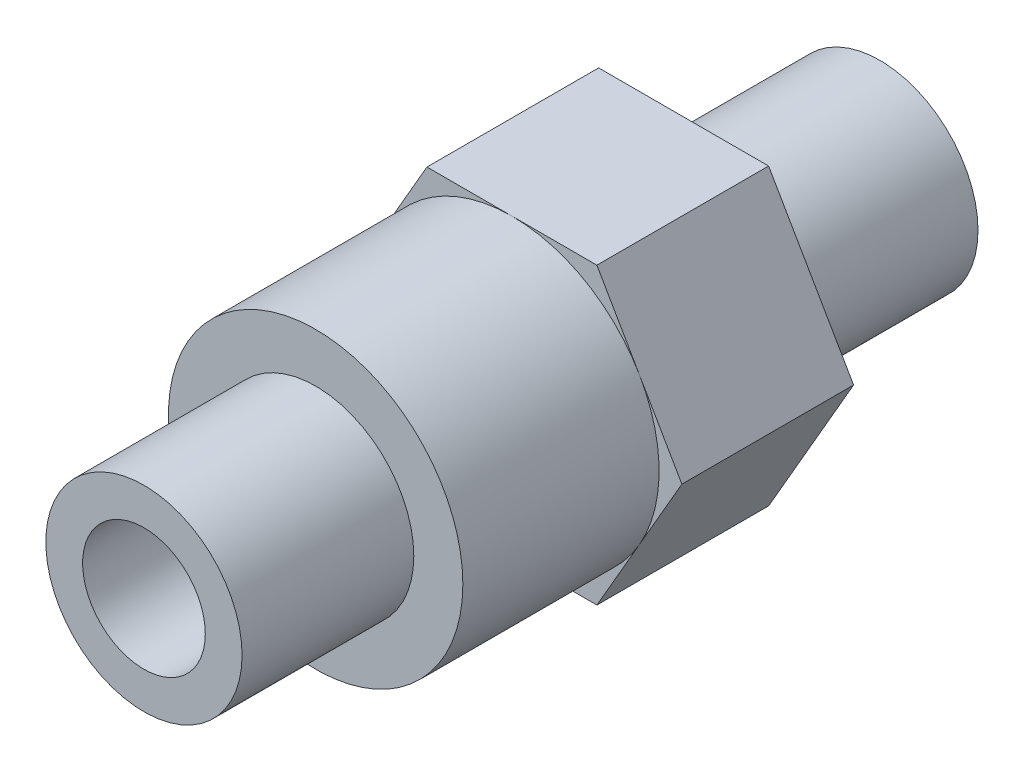
ISO-10303-21;
HEADER;
FILE_DESCRIPTION(('STEP AP214'),'2;1');
FILE_NAME('part.step','',(''),(''),'','','');
FILE_SCHEMA(('AUTOMOTIVE_DESIGN { 1 0 10303 214 1 1 1 1 }'));
ENDSEC;
DATA;
#1=APPLICATION_CONTEXT('core data for automotive mechanical design processes');
#2=APPLICATION_PROTOCOL_DEFINITION('international standard','automotive_design',2000,#1);
#3=PRODUCT_CONTEXT('',#1,'mechanical');
#4=PRODUCT('Part','Part','',(#3));
#5=PRODUCT_RELATED_PRODUCT_CATEGORY('part','',(#4));
#6=PRODUCT_DEFINITION_FORMATION('','',#4);
#7=PRODUCT_DEFINITION_CONTEXT('part definition',#1,'design');
#8=PRODUCT_DEFINITION('design','',#6,#7);
#9=PRODUCT_DEFINITION_SHAPE('','',#8);
#10=(LENGTH_UNIT() NAMED_UNIT(*) SI_UNIT(.MILLI.,.METRE.));
#11=(NAMED_UNIT(*) PLANE_ANGLE_UNIT() SI_UNIT($,.RADIAN.));
#12=(NAMED_UNIT(*) SI_UNIT($,.STERADIAN.) SOLID_ANGLE_UNIT());
#13=UNCERTAINTY_MEASURE_WITH_UNIT(LENGTH_MEASURE(1.E-05),#10,'distance_accuracy_value','');
#14=(GEOMETRIC_REPRESENTATION_CONTEXT(3) GLOBAL_UNCERTAINTY_ASSIGNED_CONTEXT((#13)) GLOBAL_UNIT_ASSIGNED_CONTEXT((#10,
#11,#12)) REPRESENTATION_CONTEXT('',''));
#15=CARTESIAN_POINT('',(0.,0.,0.));
#16=DIRECTION('',(0.,0.,1.));
#17=DIRECTION('',(1.,0.,0.));
#18=AXIS2_PLACEMENT_3D('',#15,#16,#17);
#19=CARTESIAN_POINT('',(0.,0.,0.));
#20=DIRECTION('',(0.,0.,1.));
#21=DIRECTION('',(1.,0.,0.));
#22=AXIS2_PLACEMENT_3D('',#19,#20,#21);
#23=PLANE('',#22);
#24=CARTESIAN_POINT('',(0.,0.,0.));
#25=DIRECTION('',(0.,0.,1.));
#26=DIRECTION('',(1.,0.,0.));
#27=AXIS2_PLACEMENT_3D('',#24,#25,#26);
#28=CIRCLE('',#27,6.00000000000002);
#29=CARTESIAN_POINT('',(5.19615242270663,3.00000000000004,0.));
#30=VERTEX_POINT('',#29);
#31=CARTESIAN_POINT('',(0.,6.00000000000001,0.));
#32=VERTEX_POINT('',#31);
#33=EDGE_CURVE('E47',#30,#32,#28,.T.);
#34=ORIENTED_EDGE('',*,*,#33,.F.);
#35=DIRECTION('',(-0.500000000000005,0.866025403784436,0.));
#36=VECTOR('',#35,1.);
#37=CARTESIAN_POINT('',(5.19615242270661,3.00000000000003,0.));
#38=LINE('',#37,#36);
#39=CARTESIAN_POINT('',(3.46410161513771,6.00000000000003,0.));
#40=VERTEX_POINT('',#39);
#41=EDGE_CURVE('E114',#30,#40,#38,.T.);
#42=ORIENTED_EDGE('',*,*,#41,.T.);
#43=DIRECTION('',(-1.,0.,0.));
#44=VECTOR('',#43,1.);
#45=CARTESIAN_POINT('',(0.,6.00000000000001,0.));
#46=LINE('',#45,#44);
#47=EDGE_CURVE('E126',#40,#32,#46,.T.);
#48=ORIENTED_EDGE('',*,*,#47,.T.);
#49=EDGE_LOOP('',(#34,#42,#48));
#50=FACE_BOUND('',#49,.T.);
#51=ADVANCED_FACE('F36',(#50),#23,.T.);
#52=CARTESIAN_POINT('',(-5.19615242270666,2.99999999999998,0.));
#53=VERTEX_POINT('',#52);
#54=EDGE_CURVE('E11',#32,#53,#28,.T.);
#55=ORIENTED_EDGE('',*,*,#54,.F.);
#56=CARTESIAN_POINT('',(-3.4641016151378,5.99999999999999,0.));
#57=VERTEX_POINT('',#56);
#58=EDGE_CURVE('E113',#32,#57,#46,.T.);
#59=ORIENTED_EDGE('',*,*,#58,.T.);
#60=DIRECTION('',(-0.499999999999995,-0.866025403784442,0.));
#61=VECTOR('',#60,1.);
#62=CARTESIAN_POINT('',(-5.19615242270666,2.99999999999998,0.));
#63=LINE('',#62,#61);
#64=EDGE_CURVE('E169',#57,#53,#63,.T.);
#65=ORIENTED_EDGE('',*,*,#64,.T.);
#66=EDGE_LOOP('',(#55,#59,#65));
#67=FACE_BOUND('',#66,.T.);
#68=ADVANCED_FACE('F222',(#67),#23,.T.);
#69=CARTESIAN_POINT('',(-5.19615242270658,-3.00000000000007,0.));
#70=VERTEX_POINT('',#69);
#71=EDGE_CURVE('E45',#53,#70,#28,.T.);
#72=ORIENTED_EDGE('',*,*,#71,.F.);
#73=CARTESIAN_POINT('',(-6.92820323027553,0.,0.));
#74=VERTEX_POINT('',#73);
#75=EDGE_CURVE('E151',#53,#74,#63,.T.);
#76=ORIENTED_EDGE('',*,*,#75,.T.);
#77=DIRECTION('',(0.500000000000012,-0.866025403784432,0.));
#78=VECTOR('',#77,1.);
#79=CARTESIAN_POINT('',(-5.19615242270658,-3.00000000000007,0.));
#80=LINE('',#79,#78);
#81=EDGE_CURVE('E172',#74,#70,#80,.T.);
#82=ORIENTED_EDGE('',*,*,#81,.T.);
#83=EDGE_LOOP('',(#72,#76,#82));
#84=FACE_BOUND('',#83,.T.);
#85=ADVANCED_FACE('F202',(#84),#23,.T.);
#86=CARTESIAN_POINT('',(0.,-5.99999999999999,0.));
#87=VERTEX_POINT('',#86);
#88=EDGE_CURVE('E135',#70,#87,#28,.T.);
#89=ORIENTED_EDGE('',*,*,#88,.F.);
#90=CARTESIAN_POINT('',(-3.46410161513766,-6.00000000000005,0.));
#91=VERTEX_POINT('',#90);
#92=EDGE_CURVE('E171',#70,#91,#80,.T.);
#93=ORIENTED_EDGE('',*,*,#92,.T.);
#94=DIRECTION('',(1.,0.,0.));
#95=VECTOR('',#94,1.);
#96=CARTESIAN_POINT('',(0.,-5.99999999999999,0.));
#97=LINE('',#96,#95);
#98=EDGE_CURVE('E176',#91,#87,#97,.T.);
#99=ORIENTED_EDGE('',*,*,#98,.T.);
#100=EDGE_LOOP('',(#89,#93,#99));
#101=FACE_BOUND('',#100,.T.);
#102=ADVANCED_FACE('F204',(#101),#23,.T.);
#103=CARTESIAN_POINT('',(5.19615242270668,-2.99999999999999,0.));
#104=VERTEX_POINT('',#103);
#105=EDGE_CURVE('E133',#87,#104,#28,.T.);
#106=ORIENTED_EDGE('',*,*,#105,.F.);
#107=CARTESIAN_POINT('',(3.46410161513786,-5.99999999999994,0.));
#108=VERTEX_POINT('',#107);
#109=EDGE_CURVE('E175',#87,#108,#97,.T.);
#110=ORIENTED_EDGE('',*,*,#109,.T.);
#111=DIRECTION('',(0.499999999999995,0.866025403784442,0.));
#112=VECTOR('',#111,1.);
#113=CARTESIAN_POINT('',(5.19615242270668,-2.99999999999999,0.));
#114=LINE('',#113,#112);
#115=EDGE_CURVE('E124',#108,#104,#114,.T.);
#116=ORIENTED_EDGE('',*,*,#115,.T.);
#117=EDGE_LOOP('',(#106,#110,#116));
#118=FACE_BOUND('',#117,.T.);
#119=ADVANCED_FACE('F211',(#118),#23,.T.);
#120=CARTESIAN_POINT('',(-5.19615242270666,2.99999999999998,-7.));
#121=DIRECTION('',(-0.866025403784442,0.499999999999995,0.));
#122=DIRECTION('',(-0.499999999999995,-0.866025403784442,0.));
#123=AXIS2_PLACEMENT_3D('',#120,#121,#122);
#124=PLANE('',#123);
#125=ORIENTED_EDGE('',*,*,#64,.F.);
#126=DIRECTION('',(0.,0.,1.));
#127=VECTOR('',#126,1.);
#128=CARTESIAN_POINT('',(-3.4641016151378,5.99999999999999,-7.));
#129=LINE('',#128,#127);
#130=CARTESIAN_POINT('',(-3.4641016151378,5.99999999999999,-7.));
#131=VERTEX_POINT('',#130);
#132=EDGE_CURVE('E134',#131,#57,#129,.T.);
#133=ORIENTED_EDGE('',*,*,#132,.F.);
#134=DIRECTION('',(-0.499999999999995,-0.866025403784442,0.));
#135=VECTOR('',#134,1.);
#136=CARTESIAN_POINT('',(-5.19615242270666,2.99999999999998,-7.));
#137=LINE('',#136,#135);
#138=CARTESIAN_POINT('',(-6.92820323027553,0.,-7.));
#139=VERTEX_POINT('',#138);
#140=EDGE_CURVE('E152',#131,#139,#137,.T.);
#141=ORIENTED_EDGE('',*,*,#140,.T.);
#142=DIRECTION('',(0.,0.,1.));
#143=VECTOR('',#142,1.);
#144=CARTESIAN_POINT('',(-6.92820323027553,0.,-7.));
#145=LINE('',#144,#143);
#146=EDGE_CURVE('E40',#139,#74,#145,.T.);
#147=ORIENTED_EDGE('',*,*,#146,.T.);
#148=ORIENTED_EDGE('',*,*,#75,.F.);
#149=EDGE_LOOP('',(#125,#133,#141,#147,#148));
#150=FACE_BOUND('',#149,.T.);
#151=ADVANCED_FACE('F38',(#150),#124,.T.);
#152=CARTESIAN_POINT('',(0.,6.00000000000001,-7.));
#153=DIRECTION('',(0.,1.,0.));
#154=DIRECTION('',(-1.,0.,0.));
#155=AXIS2_PLACEMENT_3D('',#152,#153,#154);
#156=PLANE('',#155);
#157=ORIENTED_EDGE('',*,*,#47,.F.);
#158=DIRECTION('',(0.,0.,1.));
#159=VECTOR('',#158,1.);
#160=CARTESIAN_POINT('',(3.46410161513771,6.00000000000003,-7.));
#161=LINE('',#160,#159);
#162=CARTESIAN_POINT('',(3.46410161513771,6.00000000000003,-7.));
#163=VERTEX_POINT('',#162);
#164=EDGE_CURVE('E120',#163,#40,#161,.T.);
#165=ORIENTED_EDGE('',*,*,#164,.F.);
#166=DIRECTION('',(-1.,0.,0.));
#167=VECTOR('',#166,1.);
#168=CARTESIAN_POINT('',(0.,6.00000000000001,-7.));
#169=LINE('',#168,#167);
#170=EDGE_CURVE('E166',#163,#131,#169,.T.);
#171=ORIENTED_EDGE('',*,*,#170,.T.);
#172=ORIENTED_EDGE('',*,*,#132,.T.);
#173=ORIENTED_EDGE('',*,*,#58,.F.);
#174=EDGE_LOOP('',(#157,#165,#171,#172,#173));
#175=FACE_BOUND('',#174,.T.);
#176=ADVANCED_FACE('F221',(#175),#156,.T.);
#177=CARTESIAN_POINT('',(5.19615242270661,3.00000000000003,-7.));
#178=DIRECTION('',(0.866025403784436,0.500000000000005,0.));
#179=DIRECTION('',(-0.500000000000005,0.866025403784436,0.));
#180=AXIS2_PLACEMENT_3D('',#177,#178,#179);
#181=PLANE('',#180);
#182=CARTESIAN_POINT('',(6.92820323027553,0.,0.));
#183=VERTEX_POINT('',#182);
#184=EDGE_CURVE('E107',#183,#30,#38,.T.);
#185=ORIENTED_EDGE('',*,*,#184,.F.);
#186=DIRECTION('',(0.,0.,1.));
#187=VECTOR('',#186,1.);
#188=CARTESIAN_POINT('',(6.92820323027553,0.,-7.));
#189=LINE('',#188,#187);
#190=CARTESIAN_POINT('',(6.92820323027553,0.,-7.));
#191=VERTEX_POINT('',#190);
#192=EDGE_CURVE('E183',#191,#183,#189,.T.);
#193=ORIENTED_EDGE('',*,*,#192,.F.);
#194=DIRECTION('',(-0.500000000000005,0.866025403784436,0.));
#195=VECTOR('',#194,1.);
#196=CARTESIAN_POINT('',(5.19615242270661,3.00000000000003,-7.));
#197=LINE('',#196,#195);
#198=EDGE_CURVE('E164',#191,#163,#197,.T.);
#199=ORIENTED_EDGE('',*,*,#198,.T.);
#200=ORIENTED_EDGE('',*,*,#164,.T.);
#201=ORIENTED_EDGE('',*,*,#41,.F.);
#202=EDGE_LOOP('',(#185,#193,#199,#200,#201));
#203=FACE_BOUND('',#202,.T.);
#204=ADVANCED_FACE('F118',(#203),#181,.T.);
#205=CARTESIAN_POINT('',(5.19615242270668,-2.99999999999999,-7.));
#206=DIRECTION('',(0.866025403784442,-0.499999999999995,0.));
#207=DIRECTION('',(0.499999999999995,0.866025403784442,0.));
#208=AXIS2_PLACEMENT_3D('',#205,#206,#207);
#209=PLANE('',#208);
#210=ORIENTED_EDGE('',*,*,#115,.F.);
#211=DIRECTION('',(0.,0.,1.));
#212=VECTOR('',#211,1.);
#213=CARTESIAN_POINT('',(3.46410161513786,-5.99999999999994,-7.));
#214=LINE('',#213,#212);
#215=CARTESIAN_POINT('',(3.46410161513786,-5.99999999999994,-7.));
#216=VERTEX_POINT('',#215);
#217=EDGE_CURVE('E185',#216,#108,#214,.T.);
#218=ORIENTED_EDGE('',*,*,#217,.F.);
#219=DIRECTION('',(0.499999999999995,0.866025403784442,0.));
#220=VECTOR('',#219,1.);
#221=CARTESIAN_POINT('',(5.19615242270668,-2.99999999999999,-7.));
#222=LINE('',#221,#220);
#223=EDGE_CURVE('E161',#216,#191,#222,.T.);
#224=ORIENTED_EDGE('',*,*,#223,.T.);
#225=ORIENTED_EDGE('',*,*,#192,.T.);
#226=EDGE_CURVE('E110',#104,#183,#114,.T.);
#227=ORIENTED_EDGE('',*,*,#226,.F.);
#228=EDGE_LOOP('',(#210,#218,#224,#225,#227));
#229=FACE_BOUND('',#228,.T.);
#230=ADVANCED_FACE('F213',(#229),#209,.T.);
#231=CARTESIAN_POINT('',(0.,-5.99999999999999,-7.));
#232=DIRECTION('',(0.,-1.,0.));
#233=DIRECTION('',(1.,0.,0.));
#234=AXIS2_PLACEMENT_3D('',#231,#232,#233);
#235=PLANE('',#234);
#236=ORIENTED_EDGE('',*,*,#98,.F.);
#237=DIRECTION('',(0.,0.,1.));
#238=VECTOR('',#237,1.);
#239=CARTESIAN_POINT('',(-3.46410161513766,-6.00000000000005,-7.));
#240=LINE('',#239,#238);
#241=CARTESIAN_POINT('',(-3.46410161513766,-6.00000000000005,-7.));
#242=VERTEX_POINT('',#241);
#243=EDGE_CURVE('E187',#242,#91,#240,.T.);
#244=ORIENTED_EDGE('',*,*,#243,.F.);
#245=DIRECTION('',(1.,0.,0.));
#246=VECTOR('',#245,1.);
#247=CARTESIAN_POINT('',(0.,-5.99999999999999,-7.));
#248=LINE('',#247,#246);
#249=EDGE_CURVE('E158',#242,#216,#248,.T.);
#250=ORIENTED_EDGE('',*,*,#249,.T.);
#251=ORIENTED_EDGE('',*,*,#217,.T.);
#252=ORIENTED_EDGE('',*,*,#109,.F.);
#253=EDGE_LOOP('',(#236,#244,#250,#251,#252));
#254=FACE_BOUND('',#253,.T.);
#255=ADVANCED_FACE('F207',(#254),#235,.T.);
#256=CARTESIAN_POINT('',(-5.19615242270658,-3.00000000000007,-7.));
#257=DIRECTION('',(-0.866025403784431,-0.500000000000012,0.));
#258=DIRECTION('',(0.500000000000012,-0.866025403784432,0.));
#259=AXIS2_PLACEMENT_3D('',#256,#257,#258);
#260=PLANE('',#259);
#261=ORIENTED_EDGE('',*,*,#81,.F.);
#262=ORIENTED_EDGE('',*,*,#146,.F.);
#263=DIRECTION('',(0.500000000000012,-0.866025403784432,0.));
#264=VECTOR('',#263,1.);
#265=CARTESIAN_POINT('',(-5.19615242270658,-3.00000000000007,-7.));
#266=LINE('',#265,#264);
#267=EDGE_CURVE('E155',#139,#242,#266,.T.);
#268=ORIENTED_EDGE('',*,*,#267,.T.);
#269=ORIENTED_EDGE('',*,*,#243,.T.);
#270=ORIENTED_EDGE('',*,*,#92,.F.);
#271=EDGE_LOOP('',(#261,#262,#268,#269,#270));
#272=FACE_BOUND('',#271,.T.);
#273=ADVANCED_FACE('F199',(#272),#260,.T.);
#274=CARTESIAN_POINT('',(0.,0.,-7.));
#275=DIRECTION('',(0.,0.,1.));
#276=DIRECTION('',(1.,0.,0.));
#277=AXIS2_PLACEMENT_3D('',#274,#275,#276);
#278=PLANE('',#277);
#279=ORIENTED_EDGE('',*,*,#140,.F.);
#280=ORIENTED_EDGE('',*,*,#170,.F.);
#281=ORIENTED_EDGE('',*,*,#198,.F.);
#282=ORIENTED_EDGE('',*,*,#223,.F.);
#283=ORIENTED_EDGE('',*,*,#249,.F.);
#284=ORIENTED_EDGE('',*,*,#267,.F.);
#285=EDGE_LOOP('',(#279,#280,#281,#282,#283,#284));
#286=FACE_BOUND('',#285,.T.);
#287=CARTESIAN_POINT('',(0.,0.,-7.));
#288=DIRECTION('',(0.,0.,1.));
#289=DIRECTION('',(1.,0.,0.));
#290=AXIS2_PLACEMENT_3D('',#287,#288,#289);
#291=CIRCLE('',#290,4.);
#292=CARTESIAN_POINT('',(4.,0.,-7.));
#293=VERTEX_POINT('',#292);
#294=EDGE_CURVE('E148',#293,#293,#291,.T.);
#295=ORIENTED_EDGE('',*,*,#294,.T.);
#296=EDGE_LOOP('',(#295));
#297=FACE_BOUND('',#296,.T.);
#298=ADVANCED_FACE('F218',(#286,#297),#278,.F.);
#299=EDGE_CURVE('E60',#104,#30,#28,.T.);
#300=ORIENTED_EDGE('',*,*,#299,.F.);
#301=ORIENTED_EDGE('',*,*,#226,.T.);
#302=ORIENTED_EDGE('',*,*,#184,.T.);
#303=EDGE_LOOP('',(#300,#301,#302));
#304=FACE_BOUND('',#303,.T.);
#305=ADVANCED_FACE('F109',(#304),#23,.T.);
#306=CARTESIAN_POINT('',(0.,0.,-15.));
#307=DIRECTION('',(0.,0.,1.));
#308=DIRECTION('',(1.,0.,0.));
#309=AXIS2_PLACEMENT_3D('',#306,#307,#308);
#310=CYLINDRICAL_SURFACE('',#309,4.);
#311=CARTESIAN_POINT('',(0.,0.,-15.));
#312=DIRECTION('',(0.,0.,1.));
#313=DIRECTION('',(1.,0.,0.));
#314=AXIS2_PLACEMENT_3D('',#311,#312,#313);
#315=CIRCLE('',#314,4.);
#316=CARTESIAN_POINT('',(4.,0.,-15.));
#317=VERTEX_POINT('',#316);
#318=EDGE_CURVE('E145',#317,#317,#315,.T.);
#319=ORIENTED_EDGE('',*,*,#318,.T.);
#320=EDGE_LOOP('',(#319));
#321=FACE_BOUND('',#320,.T.);
#322=ORIENTED_EDGE('',*,*,#294,.F.);
#323=EDGE_LOOP('',(#322));
#324=FACE_BOUND('',#323,.T.);
#325=ADVANCED_FACE('F232',(#321,#324),#310,.T.);
#326=CARTESIAN_POINT('',(0.,0.,-15.));
#327=DIRECTION('',(0.,0.,1.));
#328=DIRECTION('',(1.,0.,0.));
#329=AXIS2_PLACEMENT_3D('',#326,#327,#328);
#330=CYLINDRICAL_SURFACE('',#329,2.5);
#331=CARTESIAN_POINT('',(0.,0.,-15.));
#332=DIRECTION('',(0.,0.,1.));
#333=DIRECTION('',(1.,0.,0.));
#334=AXIS2_PLACEMENT_3D('',#331,#332,#333);
#335=CIRCLE('',#334,2.5);
#336=CARTESIAN_POINT('',(2.5,0.,-15.));
#337=VERTEX_POINT('',#336);
#338=EDGE_CURVE('E142',#337,#337,#335,.T.);
#339=ORIENTED_EDGE('',*,*,#338,.F.);
#340=EDGE_LOOP('',(#339));
#341=FACE_BOUND('',#340,.T.);
#342=CARTESIAN_POINT('',(0.,0.,15.));
#343=DIRECTION('',(0.,0.,1.));
#344=DIRECTION('',(1.,0.,0.));
#345=AXIS2_PLACEMENT_3D('',#342,#343,#344);
#346=CIRCLE('',#345,2.5);
#347=CARTESIAN_POINT('',(2.5,0.,15.));
#348=VERTEX_POINT('',#347);
#349=EDGE_CURVE('E555',#348,#348,#346,.T.);
#350=ORIENTED_EDGE('',*,*,#349,.T.);
#351=EDGE_LOOP('',(#350));
#352=FACE_BOUND('',#351,.T.);
#353=ADVANCED_FACE('F259',(#341,#352),#330,.F.);
#354=CARTESIAN_POINT('',(0.,0.,-15.));
#355=DIRECTION('',(0.,0.,1.));
#356=DIRECTION('',(1.,0.,0.));
#357=AXIS2_PLACEMENT_3D('',#354,#355,#356);
#358=PLANE('',#357);
#359=ORIENTED_EDGE('',*,*,#338,.T.);
#360=EDGE_LOOP('',(#359));
#361=FACE_BOUND('',#360,.T.);
#362=ORIENTED_EDGE('',*,*,#318,.F.);
#363=EDGE_LOOP('',(#362));
#364=FACE_BOUND('',#363,.T.);
#365=ADVANCED_FACE('F269',(#361,#364),#358,.F.);
#366=CARTESIAN_POINT('',(0.,0.,8.));
#367=DIRECTION('',(0.,0.,-1.));
#368=DIRECTION('',(-1.,0.,0.));
#369=AXIS2_PLACEMENT_3D('',#366,#367,#368);
#370=CYLINDRICAL_SURFACE('',#369,6.00000000000002);
#371=CARTESIAN_POINT('',(0.,0.,8.));
#372=DIRECTION('',(0.,0.,1.));
#373=DIRECTION('',(1.,0.,0.));
#374=AXIS2_PLACEMENT_3D('',#371,#372,#373);
#375=CIRCLE('',#374,6.00000000000002);
#376=CARTESIAN_POINT('',(6.00000000000002,0.,8.));
#377=VERTEX_POINT('',#376);
#378=EDGE_CURVE('E140',#377,#377,#375,.T.);
#379=ORIENTED_EDGE('',*,*,#378,.F.);
#380=EDGE_LOOP('',(#379));
#381=FACE_BOUND('',#380,.T.);
#382=ORIENTED_EDGE('',*,*,#33,.T.);
#383=ORIENTED_EDGE('',*,*,#54,.T.);
#384=ORIENTED_EDGE('',*,*,#71,.T.);
#385=ORIENTED_EDGE('',*,*,#88,.T.);
#386=ORIENTED_EDGE('',*,*,#105,.T.);
#387=ORIENTED_EDGE('',*,*,#299,.T.);
#388=EDGE_LOOP('',(#382,#383,#384,#385,#386,#387));
#389=FACE_BOUND('',#388,.T.);
#390=ADVANCED_FACE('F131',(#381,#389),#370,.T.);
#391=CARTESIAN_POINT('',(0.,0.,8.));
#392=DIRECTION('',(0.,0.,1.));
#393=DIRECTION('',(1.,0.,0.));
#394=AXIS2_PLACEMENT_3D('',#391,#392,#393);
#395=PLANE('',#394);
#396=CARTESIAN_POINT('',(0.,0.,8.));
#397=DIRECTION('',(0.,0.,1.));
#398=DIRECTION('',(1.,0.,0.));
#399=AXIS2_PLACEMENT_3D('',#396,#397,#398);
#400=CIRCLE('',#399,4.);
#401=CARTESIAN_POINT('',(4.,0.,8.));
#402=VERTEX_POINT('',#401);
#403=EDGE_CURVE('E128',#402,#402,#400,.T.);
#404=ORIENTED_EDGE('',*,*,#403,.F.);
#405=EDGE_LOOP('',(#404));
#406=FACE_BOUND('',#405,.T.);
#407=ORIENTED_EDGE('',*,*,#378,.T.);
#408=EDGE_LOOP('',(#407));
#409=FACE_BOUND('',#408,.T.);
#410=ADVANCED_FACE('F284',(#406,#409),#395,.T.);
#411=CARTESIAN_POINT('',(0.,0.,15.));
#412=DIRECTION('',(0.,0.,-1.));
#413=DIRECTION('',(-1.,0.,0.));
#414=AXIS2_PLACEMENT_3D('',#411,#412,#413);
#415=CYLINDRICAL_SURFACE('',#414,4.);
#416=ORIENTED_EDGE('',*,*,#403,.T.);
#417=EDGE_LOOP('',(#416));
#418=FACE_BOUND('',#417,.T.);
#419=CARTESIAN_POINT('',(0.,0.,15.));
#420=DIRECTION('',(0.,0.,1.));
#421=DIRECTION('',(1.,0.,0.));
#422=AXIS2_PLACEMENT_3D('',#419,#420,#421);
#423=CIRCLE('',#422,4.);
#424=CARTESIAN_POINT('',(4.,0.,15.));
#425=VERTEX_POINT('',#424);
#426=EDGE_CURVE('E129',#425,#425,#423,.T.);
#427=ORIENTED_EDGE('',*,*,#426,.F.);
#428=EDGE_LOOP('',(#427));
#429=FACE_BOUND('',#428,.T.);
#430=ADVANCED_FACE('F291',(#418,#429),#415,.T.);
#431=CARTESIAN_POINT('',(0.,0.,15.));
#432=DIRECTION('',(0.,0.,1.));
#433=DIRECTION('',(1.,0.,0.));
#434=AXIS2_PLACEMENT_3D('',#431,#432,#433);
#435=PLANE('',#434);
#436=ORIENTED_EDGE('',*,*,#349,.F.);
#437=EDGE_LOOP('',(#436));
#438=FACE_BOUND('',#437,.T.);
#439=ORIENTED_EDGE('',*,*,#426,.T.);
#440=EDGE_LOOP('',(#439));
#441=FACE_BOUND('',#440,.T.);
#442=ADVANCED_FACE('F299',(#438,#441),#435,.T.);
#443=CLOSED_SHELL('',(#51,#68,#85,#102,#119,#151,#176,#204,#230,#255,#273,#298,#305,#325,#353,
#365,#390,#410,#430,#442));
#444=MANIFOLD_SOLID_BREP('B2',#443);
#445=ADVANCED_BREP_SHAPE_REPRESENTATION('',(#18,#444),#14);
#446=SHAPE_DEFINITION_REPRESENTATION(#9,#445);
ENDSEC;
END-ISO-10303-21;
